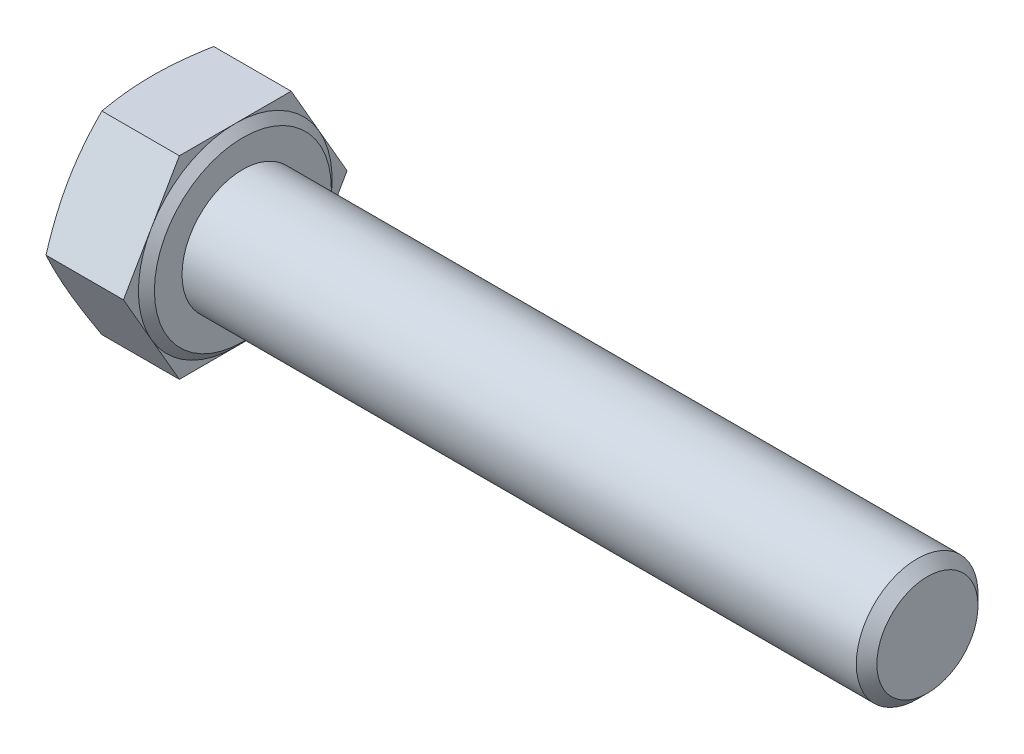
ISO-10303-21;
HEADER;
FILE_DESCRIPTION(('STEP AP214'),'2;1');
FILE_NAME('part.step','',(''),(''),'','','');
FILE_SCHEMA(('AUTOMOTIVE_DESIGN { 1 0 10303 214 1 1 1 1 }'));
ENDSEC;
DATA;
#1=APPLICATION_CONTEXT('core data for automotive mechanical design processes');
#2=APPLICATION_PROTOCOL_DEFINITION('international standard','automotive_design',2000,#1);
#3=PRODUCT_CONTEXT('',#1,'mechanical');
#4=PRODUCT('Part','Part','',(#3));
#5=PRODUCT_RELATED_PRODUCT_CATEGORY('part','',(#4));
#6=PRODUCT_DEFINITION_FORMATION('','',#4);
#7=PRODUCT_DEFINITION_CONTEXT('part definition',#1,'design');
#8=PRODUCT_DEFINITION('design','',#6,#7);
#9=PRODUCT_DEFINITION_SHAPE('','',#8);
#10=(LENGTH_UNIT() NAMED_UNIT(*) SI_UNIT(.MILLI.,.METRE.));
#11=(NAMED_UNIT(*) PLANE_ANGLE_UNIT() SI_UNIT($,.RADIAN.));
#12=(NAMED_UNIT(*) SI_UNIT($,.STERADIAN.) SOLID_ANGLE_UNIT());
#13=UNCERTAINTY_MEASURE_WITH_UNIT(LENGTH_MEASURE(1.E-05),#10,'distance_accuracy_value','');
#14=(GEOMETRIC_REPRESENTATION_CONTEXT(3) GLOBAL_UNCERTAINTY_ASSIGNED_CONTEXT((#13)) GLOBAL_UNIT_ASSIGNED_CONTEXT((#10,
#11,#12)) REPRESENTATION_CONTEXT('',''));
#15=CARTESIAN_POINT('',(0.,0.,0.));
#16=DIRECTION('',(0.,0.,1.));
#17=DIRECTION('',(1.,0.,0.));
#18=AXIS2_PLACEMENT_3D('',#15,#16,#17);
#19=CARTESIAN_POINT('',(5.95,0.,0.));
#20=DIRECTION('',(1.,0.,0.));
#21=DIRECTION('',(0.,0.,-1.));
#22=AXIS2_PLACEMENT_3D('',#19,#20,#21);
#23=PLANE('',#22);
#24=CARTESIAN_POINT('',(5.95,0.,0.));
#25=DIRECTION('',(-1.,0.,0.));
#26=DIRECTION('',(0.,0.,1.));
#27=AXIS2_PLACEMENT_3D('',#24,#25,#26);
#28=CIRCLE('',#27,5.815);
#29=CARTESIAN_POINT('',(5.95,0.,5.815));
#30=VERTEX_POINT('',#29);
#31=EDGE_CURVE('E141',#30,#30,#28,.T.);
#32=ORIENTED_EDGE('',*,*,#31,.F.);
#33=EDGE_LOOP('',(#32));
#34=FACE_BOUND('',#33,.T.);
#35=CARTESIAN_POINT('',(5.95,0.,0.));
#36=DIRECTION('',(1.,0.,0.));
#37=DIRECTION('',(0.,0.,-1.));
#38=AXIS2_PLACEMENT_3D('',#35,#36,#37);
#39=CIRCLE('',#38,4.);
#40=CARTESIAN_POINT('',(5.95,0.,4.));
#41=VERTEX_POINT('',#40);
#42=EDGE_CURVE('E142',#41,#41,#39,.T.);
#43=ORIENTED_EDGE('',*,*,#42,.F.);
#44=EDGE_LOOP('',(#43));
#45=FACE_BOUND('',#44,.T.);
#46=ADVANCED_FACE('F37',(#34,#45),#23,.T.);
#47=CARTESIAN_POINT('',(5.45,0.,-7.34966892678395));
#48=DIRECTION('',(1.,0.,0.));
#49=DIRECTION('',(0.,0.,-1.));
#50=AXIS2_PLACEMENT_3D('',#47,#48,#49);
#51=PLANE('',#50);
#52=DIRECTION('',(0.,-0.866025403784439,0.5));
#53=VECTOR('',#52,1.);
#54=CARTESIAN_POINT('',(5.45,6.365,3.67483446339196));
#55=LINE('',#54,#53);
#56=CARTESIAN_POINT('',(5.45,6.365,3.67483446339196));
#57=VERTEX_POINT('',#56);
#58=CARTESIAN_POINT('',(5.45,3.18249999999999,5.51225169508794));
#59=VERTEX_POINT('',#58);
#60=EDGE_CURVE('E140',#57,#59,#55,.T.);
#61=ORIENTED_EDGE('',*,*,#60,.T.);
#62=CARTESIAN_POINT('',(5.45,0.,0.));
#63=DIRECTION('',(-1.,0.,0.));
#64=DIRECTION('',(0.,0.,1.));
#65=AXIS2_PLACEMENT_3D('',#62,#63,#64);
#66=CIRCLE('',#65,6.365);
#67=CARTESIAN_POINT('',(5.45,6.365,0.));
#68=VERTEX_POINT('',#67);
#69=EDGE_CURVE('E52',#59,#68,#66,.T.);
#70=ORIENTED_EDGE('',*,*,#69,.T.);
#71=DIRECTION('',(0.,0.,1.));
#72=VECTOR('',#71,1.);
#73=CARTESIAN_POINT('',(5.45,6.365,-3.67483446339198));
#74=LINE('',#73,#72);
#75=EDGE_CURVE('E137',#68,#57,#74,.T.);
#76=ORIENTED_EDGE('',*,*,#75,.T.);
#77=EDGE_LOOP('',(#61,#70,#76));
#78=FACE_BOUND('',#77,.T.);
#79=ADVANCED_FACE('F136',(#78),#51,.T.);
#80=CARTESIAN_POINT('',(5.45,6.365,-3.67483446339198));
#81=VERTEX_POINT('',#80);
#82=EDGE_CURVE('E148',#81,#68,#74,.T.);
#83=ORIENTED_EDGE('',*,*,#82,.T.);
#84=CARTESIAN_POINT('',(5.45,3.1825,-5.51225169508795));
#85=VERTEX_POINT('',#84);
#86=EDGE_CURVE('E125',#68,#85,#66,.T.);
#87=ORIENTED_EDGE('',*,*,#86,.T.);
#88=DIRECTION('',(0.,0.866025403784438,0.5));
#89=VECTOR('',#88,1.);
#90=CARTESIAN_POINT('',(5.45,0.,-7.34966892678395));
#91=LINE('',#90,#89);
#92=EDGE_CURVE('E154',#85,#81,#91,.T.);
#93=ORIENTED_EDGE('',*,*,#92,.T.);
#94=EDGE_LOOP('',(#83,#87,#93));
#95=FACE_BOUND('',#94,.T.);
#96=ADVANCED_FACE('F153',(#95),#51,.T.);
#97=CARTESIAN_POINT('',(5.45,0.,-7.34966892678395));
#98=VERTEX_POINT('',#97);
#99=EDGE_CURVE('E151',#98,#85,#91,.T.);
#100=ORIENTED_EDGE('',*,*,#99,.T.);
#101=CARTESIAN_POINT('',(5.45,-3.1825,-5.51225169508795));
#102=VERTEX_POINT('',#101);
#103=EDGE_CURVE('E128',#85,#102,#66,.T.);
#104=ORIENTED_EDGE('',*,*,#103,.T.);
#105=DIRECTION('',(0.,0.866025403784438,-0.5));
#106=VECTOR('',#105,1.);
#107=CARTESIAN_POINT('',(5.45,-6.365,-3.67483446339198));
#108=LINE('',#107,#106);
#109=EDGE_CURVE('E299',#102,#98,#108,.T.);
#110=ORIENTED_EDGE('',*,*,#109,.T.);
#111=EDGE_LOOP('',(#100,#104,#110));
#112=FACE_BOUND('',#111,.T.);
#113=ADVANCED_FACE('F443',(#112),#51,.T.);
#114=CARTESIAN_POINT('',(5.45,-6.365,-3.67483446339198));
#115=VERTEX_POINT('',#114);
#116=EDGE_CURVE('E297',#115,#102,#108,.T.);
#117=ORIENTED_EDGE('',*,*,#116,.T.);
#118=CARTESIAN_POINT('',(5.45,-6.365,0.));
#119=VERTEX_POINT('',#118);
#120=EDGE_CURVE('E367',#102,#119,#66,.T.);
#121=ORIENTED_EDGE('',*,*,#120,.T.);
#122=DIRECTION('',(0.,0.,-1.));
#123=VECTOR('',#122,1.);
#124=CARTESIAN_POINT('',(5.45,-6.365,3.67483446339195));
#125=LINE('',#124,#123);
#126=EDGE_CURVE('E165',#119,#115,#125,.T.);
#127=ORIENTED_EDGE('',*,*,#126,.T.);
#128=EDGE_LOOP('',(#117,#121,#127));
#129=FACE_BOUND('',#128,.T.);
#130=ADVANCED_FACE('F451',(#129),#51,.T.);
#131=CARTESIAN_POINT('',(5.45,-6.365,3.67483446339195));
#132=VERTEX_POINT('',#131);
#133=EDGE_CURVE('E166',#132,#119,#125,.T.);
#134=ORIENTED_EDGE('',*,*,#133,.T.);
#135=CARTESIAN_POINT('',(5.45,-3.1825,5.51225169508795));
#136=VERTEX_POINT('',#135);
#137=EDGE_CURVE('E366',#119,#136,#66,.T.);
#138=ORIENTED_EDGE('',*,*,#137,.T.);
#139=DIRECTION('',(0.,-0.866025403784438,-0.5));
#140=VECTOR('',#139,1.);
#141=CARTESIAN_POINT('',(5.45,0.,7.34966892678392));
#142=LINE('',#141,#140);
#143=EDGE_CURVE('E161',#136,#132,#142,.T.);
#144=ORIENTED_EDGE('',*,*,#143,.T.);
#145=EDGE_LOOP('',(#134,#138,#144));
#146=FACE_BOUND('',#145,.T.);
#147=ADVANCED_FACE('F281',(#146),#51,.T.);
#148=CARTESIAN_POINT('',(5.45,0.,7.34966892678392));
#149=VERTEX_POINT('',#148);
#150=EDGE_CURVE('E162',#149,#136,#142,.T.);
#151=ORIENTED_EDGE('',*,*,#150,.T.);
#152=EDGE_CURVE('E143',#136,#59,#66,.T.);
#153=ORIENTED_EDGE('',*,*,#152,.T.);
#154=EDGE_CURVE('E156',#59,#149,#55,.T.);
#155=ORIENTED_EDGE('',*,*,#154,.T.);
#156=EDGE_LOOP('',(#151,#153,#155));
#157=FACE_BOUND('',#156,.T.);
#158=ADVANCED_FACE('F208',(#157),#51,.T.);
#159=CARTESIAN_POINT('',(5.45,-6.365,-3.67483446339198));
#160=DIRECTION('',(0.,0.5,0.866025403784438));
#161=DIRECTION('',(0.,-0.866025403784439,0.5));
#162=AXIS2_PLACEMENT_3D('',#159,#160,#161);
#163=PLANE('',#162);
#164=CARTESIAN_POINT('',(0.358432208609166,0.000200000000001466,-7.34978439683779));
#165=CARTESIAN_POINT('',(0.303017853386465,-0.263405120230137,-7.19759190971315));
#166=CARTESIAN_POINT('',(0.252608898537306,-0.52787949910755,-7.04489755587452));
#167=CARTESIAN_POINT('',(0.163922131489337,-1.05854790500846,-6.73851600887719));
#168=CARTESIAN_POINT('',(0.125653812123524,-1.3247431124377,-6.58482813421094));
#169=CARTESIAN_POINT('',(0.0637558982239302,-1.85589900422329,-6.27816513710687));
#170=CARTESIAN_POINT('',(0.0399912941880073,-2.12084755808325,-6.12519701821442));
#171=CARTESIAN_POINT('',(0.00811628005094213,-2.65136425446848,-5.81890306074682));
#172=CARTESIAN_POINT('',(0.,-2.91693212723424,-5.66557737791739));
#173=CARTESIAN_POINT('',(0.,-3.44806787276576,-5.35892601225854));
#174=CARTESIAN_POINT('',(0.00811628005094204,-3.71363574553151,-5.20560032942911));
#175=CARTESIAN_POINT('',(0.0399912941880067,-4.24415244191675,-4.8993063719615));
#176=CARTESIAN_POINT('',(0.0637558982239292,-4.50910099577671,-4.74633825306905));
#177=CARTESIAN_POINT('',(0.125653812123522,-5.0402568875623,-4.43967525596499));
#178=CARTESIAN_POINT('',(0.163922131489336,-5.30645209499153,-4.28598738129873));
#179=CARTESIAN_POINT('',(0.252608898537303,-5.83712050089245,-3.97960583430141));
#180=CARTESIAN_POINT('',(0.303017853386463,-6.10159487976986,-3.82691148046277));
#181=CARTESIAN_POINT('',(0.358432208609164,-6.3652,-3.67471899333814));
#182=B_SPLINE_CURVE_WITH_KNOTS('',3,(#164,#165,#166,#167,#168,#169,#170,#171,#172,#173,#174,
#175,#176,#177,#178,#179,#180,#181),.UNSPECIFIED.,.F.,.F.,(4,2,2,2,2,2,2,2,4),(0.,
0.928259882660236,1.85724379836754,2.77744274027351,3.69729643285266,4.6171501254318,
5.53734906733777,6.46633298304508,7.39459286570531),.UNSPECIFIED.);
#183=CARTESIAN_POINT('',(0.358390179956195,0.,-7.34966892678395));
#184=VERTEX_POINT('',#183);
#185=CARTESIAN_POINT('',(0.,-3.1825,-5.51225169508795));
#186=VERTEX_POINT('',#185);
#187=EDGE_CURVE('E287',#184,#186,#182,.T.);
#188=ORIENTED_EDGE('',*,*,#187,.F.);
#189=DIRECTION('',(-1.,0.,0.));
#190=VECTOR('',#189,1.);
#191=CARTESIAN_POINT('',(5.45,0.,-7.34966892678395));
#192=LINE('',#191,#190);
#193=EDGE_CURVE('E181',#98,#184,#192,.T.);
#194=ORIENTED_EDGE('',*,*,#193,.F.);
#195=ORIENTED_EDGE('',*,*,#109,.F.);
#196=ORIENTED_EDGE('',*,*,#116,.F.);
#197=DIRECTION('',(-1.,0.,0.));
#198=VECTOR('',#197,1.);
#199=CARTESIAN_POINT('',(5.45,-6.365,-3.67483446339198));
#200=LINE('',#199,#198);
#201=CARTESIAN_POINT('',(0.358390179956195,-6.365,-3.67483446339199));
#202=VERTEX_POINT('',#201);
#203=EDGE_CURVE('E169',#115,#202,#200,.T.);
#204=ORIENTED_EDGE('',*,*,#203,.T.);
#205=EDGE_CURVE('E243',#186,#202,#182,.T.);
#206=ORIENTED_EDGE('',*,*,#205,.F.);
#207=EDGE_LOOP('',(#188,#194,#195,#196,#204,#206));
#208=FACE_BOUND('',#207,.T.);
#209=ADVANCED_FACE('F272',(#208),#163,.F.);
#210=CARTESIAN_POINT('',(5.45,0.,-7.34966892678395));
#211=DIRECTION('',(0.,-0.5,0.866025403784438));
#212=DIRECTION('',(0.,-0.866025403784438,-0.5));
#213=AXIS2_PLACEMENT_3D('',#210,#211,#212);
#214=PLANE('',#213);
#215=CARTESIAN_POINT('',(0.358432208609163,6.3652,-3.67471899333814));
#216=CARTESIAN_POINT('',(0.303017853386462,6.10159487976986,-3.82691148046277));
#217=CARTESIAN_POINT('',(0.252608898537303,5.83712050089245,-3.97960583430141));
#218=CARTESIAN_POINT('',(0.163922131489336,5.30645209499153,-4.28598738129873));
#219=CARTESIAN_POINT('',(0.125653812123522,5.0402568875623,-4.43967525596499));
#220=CARTESIAN_POINT('',(0.0637558982239288,4.50910099577671,-4.74633825306905));
#221=CARTESIAN_POINT('',(0.0399912941880062,4.24415244191675,-4.8993063719615));
#222=CARTESIAN_POINT('',(0.00811628005094158,3.71363574553151,-5.20560032942911));
#223=CARTESIAN_POINT('',(0.,3.44806787276576,-5.35892601225853));
#224=CARTESIAN_POINT('',(0.,2.91693212723424,-5.66557737791739));
#225=CARTESIAN_POINT('',(0.00811628005094232,2.65136425446849,-5.81890306074681));
#226=CARTESIAN_POINT('',(0.0399912941880074,2.12084755808325,-6.12519701821442));
#227=CARTESIAN_POINT('',(0.0637558982239301,1.85589900422329,-6.27816513710687));
#228=CARTESIAN_POINT('',(0.125653812123523,1.3247431124377,-6.58482813421094));
#229=CARTESIAN_POINT('',(0.163922131489337,1.05854790500846,-6.73851600887719));
#230=CARTESIAN_POINT('',(0.252608898537306,0.527879499107553,-7.04489755587452));
#231=CARTESIAN_POINT('',(0.303017853386465,0.263405120230139,-7.19759190971315));
#232=CARTESIAN_POINT('',(0.358432208609166,-0.000199999999999462,-7.34978439683778));
#233=B_SPLINE_CURVE_WITH_KNOTS('',3,(#215,#216,#217,#218,#219,#220,#221,#222,#223,#224,#225,
#226,#227,#228,#229,#230,#231,#232),.UNSPECIFIED.,.F.,.F.,(4,2,2,2,2,2,2,2,4),(0.,
0.928259882660236,1.85724379836754,2.77744274027351,3.69729643285265,4.6171501254318,
5.53734906733777,6.46633298304507,7.39459286570531),.UNSPECIFIED.);
#234=CARTESIAN_POINT('',(0.358390179956195,6.365,-3.67483446339199));
#235=VERTEX_POINT('',#234);
#236=CARTESIAN_POINT('',(0.,3.1825,-5.51225169508795));
#237=VERTEX_POINT('',#236);
#238=EDGE_CURVE('E262',#235,#237,#233,.T.);
#239=ORIENTED_EDGE('',*,*,#238,.F.);
#240=DIRECTION('',(-1.,0.,0.));
#241=VECTOR('',#240,1.);
#242=CARTESIAN_POINT('',(5.45,6.365,-3.67483446339198));
#243=LINE('',#242,#241);
#244=EDGE_CURVE('E179',#81,#235,#243,.T.);
#245=ORIENTED_EDGE('',*,*,#244,.F.);
#246=ORIENTED_EDGE('',*,*,#92,.F.);
#247=ORIENTED_EDGE('',*,*,#99,.F.);
#248=ORIENTED_EDGE('',*,*,#193,.T.);
#249=EDGE_CURVE('E256',#237,#184,#233,.T.);
#250=ORIENTED_EDGE('',*,*,#249,.F.);
#251=EDGE_LOOP('',(#239,#245,#246,#247,#248,#250));
#252=FACE_BOUND('',#251,.T.);
#253=ADVANCED_FACE('F269',(#252),#214,.F.);
#254=CARTESIAN_POINT('',(5.45,6.365,-3.67483446339198));
#255=DIRECTION('',(0.,-1.,0.));
#256=DIRECTION('',(0.,0.,-1.));
#257=AXIS2_PLACEMENT_3D('',#254,#255,#256);
#258=PLANE('',#257);
#259=CARTESIAN_POINT('',(1.91509499186738,6.365,-9.7296694984424));
#260=CARTESIAN_POINT('',(1.8274065254308,6.365,-9.44169388100943));
#261=CARTESIAN_POINT('',(1.74074126923369,6.365,-9.15340090389345));
#262=CARTESIAN_POINT('',(1.57002321571733,6.365,-8.57601866069179));
#263=CARTESIAN_POINT('',(1.48597062512317,6.365,-8.28692933355569));
#264=CARTESIAN_POINT('',(1.32090412051867,6.365,-7.70729801333674));
#265=CARTESIAN_POINT('',(1.23989616851068,6.365,-7.41675431626873));
#266=CARTESIAN_POINT('',(1.08186732342096,6.365,-6.83458613240287));
#267=CARTESIAN_POINT('',(1.00484635875195,6.365,-6.54296166511132));
#268=CARTESIAN_POINT('',(0.856697872735636,6.365,-5.96204124254702));
#269=CARTESIAN_POINT('',(0.785509396690932,6.365,-5.67276090957682));
#270=CARTESIAN_POINT('',(0.64919328993161,6.365,-5.09276074741789));
#271=CARTESIAN_POINT('',(0.584065761213718,6.365,-4.80204089409086));
#272=CARTESIAN_POINT('',(0.461389936625072,6.365,-4.21909663970475));
#273=CARTESIAN_POINT('',(0.403839055373967,6.365,-3.92687278740828));
#274=CARTESIAN_POINT('',(0.2980689318816,6.365,-3.3407285208215));
#275=CARTESIAN_POINT('',(0.249849376986923,6.365,-3.04680816371385));
#276=CARTESIAN_POINT('',(0.169475259692935,6.365,-2.4903674737322));
#277=CARTESIAN_POINT('',(0.136125658249983,6.365,-2.2280213791775));
#278=CARTESIAN_POINT('',(0.0796727278870323,6.365,-1.70221986064311));
#279=CARTESIAN_POINT('',(0.0565691003887711,6.365,-1.43876446921536));
#280=CARTESIAN_POINT('',(0.0217207413568141,6.365,-0.911278741623913));
#281=CARTESIAN_POINT('',(0.00996797550584855,6.365,-0.64724894489987));
#282=CARTESIAN_POINT('',(-0.00158362003896366,6.365,-0.118925195375255));
#283=CARTESIAN_POINT('',(-0.00138253415055085,6.365,0.145368755546687));
#284=CARTESIAN_POINT('',(0.0109939536907339,6.365,0.675012581557852));
#285=CARTESIAN_POINT('',(0.0232300782774895,6.365,0.940361014088002));
#286=CARTESIAN_POINT('',(0.0591135341292779,6.365,1.47027848456429));
#287=CARTESIAN_POINT('',(0.0827611395476106,6.365,1.73484750363189));
#288=CARTESIAN_POINT('',(0.140361333008317,6.365,2.26307550737216));
#289=CARTESIAN_POINT('',(0.1743227721838,6.365,2.526733512897));
#290=CARTESIAN_POINT('',(0.251173066655275,6.365,3.0527305061695));
#291=CARTESIAN_POINT('',(0.294061969799614,6.365,3.31506948683989));
#292=CARTESIAN_POINT('',(0.38983936183337,6.365,3.85223342679726));
#293=CARTESIAN_POINT('',(0.443136786671213,6.365,4.12698482215219));
#294=CARTESIAN_POINT('',(0.556591356183898,6.365,4.67507669275939));
#295=CARTESIAN_POINT('',(0.616749018019993,6.365,4.94841706001511));
#296=CARTESIAN_POINT('',(0.742660775422184,6.365,5.49388169043513));
#297=CARTESIAN_POINT('',(0.808416496316156,6.365,5.76600557610647));
#298=CARTESIAN_POINT('',(0.944455081390743,6.365,6.3091069066798));
#299=CARTESIAN_POINT('',(1.01473783705961,6.365,6.58008437889518));
#300=CARTESIAN_POINT('',(1.1590752234491,6.365,7.12140066025615));
#301=CARTESIAN_POINT('',(1.23313456342593,6.365,7.39173820927582));
#302=CARTESIAN_POINT('',(1.38427072653871,6.365,7.93157008073457));
#303=CARTESIAN_POINT('',(1.46134759410965,6.365,8.20106439069327));
#304=CARTESIAN_POINT('',(1.6962389843436,6.365,9.00837554769516));
#305=CARTESIAN_POINT('',(1.85774092685403,6.365,9.54511881028881));
#306=CARTESIAN_POINT('',(2.18566542053362,6.365,10.6106008162262));
#307=CARTESIAN_POINT('',(2.35201398242583,6.365,11.1393625186539));
#308=CARTESIAN_POINT('',(2.68943708333289,6.365,12.1954006558518));
#309=CARTESIAN_POINT('',(2.86051184909409,6.365,12.7226770180188));
#310=CARTESIAN_POINT('',(3.20545958847819,6.365,13.7740953538946));
#311=CARTESIAN_POINT('',(3.37931948179169,6.365,14.2982416293346));
#312=CARTESIAN_POINT('',(3.64203874267391,6.365,15.0837909084871));
#313=CARTESIAN_POINT('',(3.72992982044976,6.365,15.3455184496298));
#314=CARTESIAN_POINT('',(3.9062806915208,6.365,15.8687811832806));
#315=CARTESIAN_POINT('',(3.99474048342973,6.365,16.1303163762558));
#316=CARTESIAN_POINT('',(4.08344651066457,6.365,16.3917680143764));
#317=B_SPLINE_CURVE_WITH_KNOTS('',3,(#259,#260,#261,#262,#263,#264,#265,#266,#267,#268,#269,
#270,#271,#272,#273,#274,#275,#276,#277,#278,#279,#280,#281,#282,#283,#284,#285,#286,#287,#288,
#289,#290,#291,#292,#293,#294,#295,#296,#297,#298,#299,#300,#301,#302,#303,#304,#305,#306,#307,
#308,#309,#310,#311,#312,#313,#314,#315,#316),.UNSPECIFIED.,.F.,.F.,(4,2,2,2,2,2,2,2,2,2,2,2,2,
2,2,2,2,2,2,2,2,2,2,2,2,2,2,2,4),(0.,0.903097207575023,1.80626569103696,2.71111926177277,
3.61595658001542,4.50963771767758,5.40333389194527,6.29672431533665,7.19008479979588,
7.98328255418382,8.77645719245087,9.56906999696307,10.3616772040682,11.1583041227231,
11.9549501807672,12.7522818463206,13.5496177854262,14.3891296715289,15.2287048864037,
16.0685246984409,16.9083243877203,17.7491981806695,18.5900843606705,20.2715515655816,
21.9344590099833,23.5974463737565,25.2541238016063,26.0823957883024,26.9106657568178),.UNSPECIFIED.);
#318=CARTESIAN_POINT('',(0.358390179956196,6.36500000000003,3.67483446339194));
#319=VERTEX_POINT('',#318);
#320=CARTESIAN_POINT('',(0.,6.365,0.));
#321=VERTEX_POINT('',#320);
#322=EDGE_CURVE('E60',#319,#321,#317,.F.);
#323=ORIENTED_EDGE('',*,*,#322,.F.);
#324=DIRECTION('',(-1.,0.,0.));
#325=VECTOR('',#324,1.);
#326=CARTESIAN_POINT('',(5.45,6.365,3.67483446339196));
#327=LINE('',#326,#325);
#328=EDGE_CURVE('E150',#57,#319,#327,.T.);
#329=ORIENTED_EDGE('',*,*,#328,.F.);
#330=ORIENTED_EDGE('',*,*,#75,.F.);
#331=ORIENTED_EDGE('',*,*,#82,.F.);
#332=ORIENTED_EDGE('',*,*,#244,.T.);
#333=EDGE_CURVE('E263',#321,#235,#317,.F.);
#334=ORIENTED_EDGE('',*,*,#333,.F.);
#335=EDGE_LOOP('',(#323,#329,#330,#331,#332,#334));
#336=FACE_BOUND('',#335,.T.);
#337=ADVANCED_FACE('F146',(#336),#258,.F.);
#338=CARTESIAN_POINT('',(5.45,6.365,3.67483446339196));
#339=DIRECTION('',(0.,-0.5,-0.866025403784439));
#340=DIRECTION('',(0.,0.866025403784439,-0.5));
#341=AXIS2_PLACEMENT_3D('',#338,#339,#340);
#342=PLANE('',#341);
#343=CARTESIAN_POINT('',(0.358432208609158,-0.000200000000000945,7.34978439683776));
#344=CARTESIAN_POINT('',(0.303017853386457,0.263405120230138,7.19759190971313));
#345=CARTESIAN_POINT('',(0.252608898537298,0.527879499107551,7.04489755587449));
#346=CARTESIAN_POINT('',(0.16392213148933,1.05854790500846,6.73851600887717));
#347=CARTESIAN_POINT('',(0.125653812123516,1.3247431124377,6.58482813421092));
#348=CARTESIAN_POINT('',(0.0637558982239226,1.85589900422329,6.27816513710685));
#349=CARTESIAN_POINT('',(0.039991294188,2.12084755808325,6.1251970182144));
#350=CARTESIAN_POINT('',(0.008116280050935,2.65136425446849,5.81890306074679));
#351=CARTESIAN_POINT('',(0.,2.91693212723424,5.66557737791737));
#352=CARTESIAN_POINT('',(0.,3.44806787276576,5.35892601225851));
#353=CARTESIAN_POINT('',(0.00811628005093566,3.71363574553151,5.20560032942909));
#354=CARTESIAN_POINT('',(0.039991294188001,4.24415244191675,4.89930637196148));
#355=CARTESIAN_POINT('',(0.0637558982239236,4.50910099577671,4.74633825306903));
#356=CARTESIAN_POINT('',(0.125653812123517,5.0402568875623,4.43967525596496));
#357=CARTESIAN_POINT('',(0.163922131489331,5.30645209499154,4.28598738129871));
#358=CARTESIAN_POINT('',(0.2526088985373,5.83712050089245,3.97960583430138));
#359=CARTESIAN_POINT('',(0.303017853386459,6.10159487976986,3.82691148046275));
#360=CARTESIAN_POINT('',(0.35843220860916,6.3652,3.67471899333812));
#361=B_SPLINE_CURVE_WITH_KNOTS('',3,(#343,#344,#345,#346,#347,#348,#349,#350,#351,#352,#353,
#354,#355,#356,#357,#358,#359,#360),.UNSPECIFIED.,.F.,.F.,(4,2,2,2,2,2,2,2,4),(0.,
0.928259882660236,1.85724379836754,2.77744274027351,3.69729643285266,4.6171501254318,
5.53734906733777,6.46633298304508,7.39459286570531),.UNSPECIFIED.);
#362=CARTESIAN_POINT('',(0.358390179956197,0.,7.34966892678395));
#363=VERTEX_POINT('',#362);
#364=CARTESIAN_POINT('',(0.,3.1825,5.51225169508795));
#365=VERTEX_POINT('',#364);
#366=EDGE_CURVE('E249',#363,#365,#361,.T.);
#367=ORIENTED_EDGE('',*,*,#366,.F.);
#368=DIRECTION('',(-1.,0.,0.));
#369=VECTOR('',#368,1.);
#370=CARTESIAN_POINT('',(5.45,0.,7.34966892678392));
#371=LINE('',#370,#369);
#372=EDGE_CURVE('E175',#149,#363,#371,.T.);
#373=ORIENTED_EDGE('',*,*,#372,.F.);
#374=ORIENTED_EDGE('',*,*,#154,.F.);
#375=ORIENTED_EDGE('',*,*,#60,.F.);
#376=ORIENTED_EDGE('',*,*,#328,.T.);
#377=EDGE_CURVE('E303',#365,#319,#361,.T.);
#378=ORIENTED_EDGE('',*,*,#377,.F.);
#379=EDGE_LOOP('',(#367,#373,#374,#375,#376,#378));
#380=FACE_BOUND('',#379,.T.);
#381=ADVANCED_FACE('F352',(#380),#342,.F.);
#382=CARTESIAN_POINT('',(5.45,0.,7.34966892678392));
#383=DIRECTION('',(0.,0.5,-0.866025403784438));
#384=DIRECTION('',(0.,0.866025403784438,0.5));
#385=AXIS2_PLACEMENT_3D('',#382,#383,#384);
#386=PLANE('',#385);
#387=CARTESIAN_POINT('',(0.358432208609159,-6.3652,3.67471899333812));
#388=CARTESIAN_POINT('',(0.303017853386458,-6.10159487976986,3.82691148046275));
#389=CARTESIAN_POINT('',(0.252608898537299,-5.83712050089245,3.97960583430138));
#390=CARTESIAN_POINT('',(0.163922131489331,-5.30645209499153,4.28598738129871));
#391=CARTESIAN_POINT('',(0.125653812123517,-5.0402568875623,4.43967525596496));
#392=CARTESIAN_POINT('',(0.0637558982239232,-4.50910099577671,4.74633825306903));
#393=CARTESIAN_POINT('',(0.0399912941880006,-4.24415244191675,4.89930637196148));
#394=CARTESIAN_POINT('',(0.00811628005093541,-3.71363574553151,5.20560032942909));
#395=CARTESIAN_POINT('',(0.,-3.44806787276576,5.35892601225851));
#396=CARTESIAN_POINT('',(0.,-2.91693212723424,5.66557737791736));
#397=CARTESIAN_POINT('',(0.00811628005093514,-2.65136425446849,5.81890306074679));
#398=CARTESIAN_POINT('',(0.039991294188,-2.12084755808325,6.1251970182144));
#399=CARTESIAN_POINT('',(0.0637558982239224,-1.85589900422329,6.27816513710685));
#400=CARTESIAN_POINT('',(0.125653812123515,-1.3247431124377,6.58482813421091));
#401=CARTESIAN_POINT('',(0.163922131489329,-1.05854790500847,6.73851600887717));
#402=CARTESIAN_POINT('',(0.252608898537298,-0.527879499107553,7.04489755587449));
#403=CARTESIAN_POINT('',(0.303017853386457,-0.263405120230141,7.19759190971313));
#404=CARTESIAN_POINT('',(0.358432208609158,0.000199999999998151,7.34978439683776));
#405=B_SPLINE_CURVE_WITH_KNOTS('',3,(#387,#388,#389,#390,#391,#392,#393,#394,#395,#396,#397,
#398,#399,#400,#401,#402,#403,#404),.UNSPECIFIED.,.F.,.F.,(4,2,2,2,2,2,2,2,4),(0.,
0.928259882660235,1.85724379836754,2.77744274027351,3.69729643285265,4.6171501254318,
5.53734906733777,6.46633298304507,7.39459286570531),.UNSPECIFIED.);
#406=CARTESIAN_POINT('',(0.358390179956196,-6.365,3.67483446339199));
#407=VERTEX_POINT('',#406);
#408=CARTESIAN_POINT('',(0.,-3.1825,5.51225169508795));
#409=VERTEX_POINT('',#408);
#410=EDGE_CURVE('E235',#407,#409,#405,.T.);
#411=ORIENTED_EDGE('',*,*,#410,.F.);
#412=DIRECTION('',(-1.,0.,0.));
#413=VECTOR('',#412,1.);
#414=CARTESIAN_POINT('',(5.45,-6.365,3.67483446339195));
#415=LINE('',#414,#413);
#416=EDGE_CURVE('E172',#132,#407,#415,.T.);
#417=ORIENTED_EDGE('',*,*,#416,.F.);
#418=ORIENTED_EDGE('',*,*,#143,.F.);
#419=ORIENTED_EDGE('',*,*,#150,.F.);
#420=ORIENTED_EDGE('',*,*,#372,.T.);
#421=EDGE_CURVE('E291',#409,#363,#405,.T.);
#422=ORIENTED_EDGE('',*,*,#421,.F.);
#423=EDGE_LOOP('',(#411,#417,#418,#419,#420,#422));
#424=FACE_BOUND('',#423,.T.);
#425=ADVANCED_FACE('F348',(#424),#386,.F.);
#426=CARTESIAN_POINT('',(5.45,-6.365,3.67483446339195));
#427=DIRECTION('',(0.,1.,0.));
#428=DIRECTION('',(0.,0.,1.));
#429=AXIS2_PLACEMENT_3D('',#426,#427,#428);
#430=PLANE('',#429);
#431=CARTESIAN_POINT('',(1.91509499186738,-6.365,-9.7296694984424));
#432=CARTESIAN_POINT('',(1.8274065254308,-6.365,-9.44169388100943));
#433=CARTESIAN_POINT('',(1.74074126923369,-6.365,-9.15340090389345));
#434=CARTESIAN_POINT('',(1.57002321571733,-6.365,-8.57601866069178));
#435=CARTESIAN_POINT('',(1.48597062512317,-6.365,-8.28692933355569));
#436=CARTESIAN_POINT('',(1.32090412051867,-6.365,-7.70729801333674));
#437=CARTESIAN_POINT('',(1.23989616851068,-6.365,-7.41675431626872));
#438=CARTESIAN_POINT('',(1.08186732342096,-6.365,-6.83458613240287));
#439=CARTESIAN_POINT('',(1.00484635875195,-6.365,-6.54296166511132));
#440=CARTESIAN_POINT('',(0.856697872735636,-6.365,-5.96204124254702));
#441=CARTESIAN_POINT('',(0.785509396690932,-6.365,-5.67276090957682));
#442=CARTESIAN_POINT('',(0.649193289931609,-6.365,-5.09276074741789));
#443=CARTESIAN_POINT('',(0.584065761213718,-6.365,-4.80204089409086));
#444=CARTESIAN_POINT('',(0.461389936625072,-6.365,-4.21909663970475));
#445=CARTESIAN_POINT('',(0.403839055373967,-6.365,-3.92687278740828));
#446=CARTESIAN_POINT('',(0.2980689318816,-6.365,-3.3407285208215));
#447=CARTESIAN_POINT('',(0.249849376986923,-6.365,-3.04680816371385));
#448=CARTESIAN_POINT('',(0.169475259692935,-6.365,-2.4903674737322));
#449=CARTESIAN_POINT('',(0.136125658249983,-6.365,-2.2280213791775));
#450=CARTESIAN_POINT('',(0.0796727278870323,-6.365,-1.70221986064312));
#451=CARTESIAN_POINT('',(0.0565691003887709,-6.365,-1.43876446921537));
#452=CARTESIAN_POINT('',(0.0217207413568139,-6.365,-0.911278741623917));
#453=CARTESIAN_POINT('',(0.00996797550584833,-6.365,-0.647248944899874));
#454=CARTESIAN_POINT('',(-0.00158362003896379,-6.365,-0.118925195375259));
#455=CARTESIAN_POINT('',(-0.00138253415055093,-6.365,0.145368755546683));
#456=CARTESIAN_POINT('',(0.0109939536907337,-6.365,0.675012581557848));
#457=CARTESIAN_POINT('',(0.0232300782774892,-6.365,0.940361014087999));
#458=CARTESIAN_POINT('',(0.0591135341292773,-6.365,1.47027848456429));
#459=CARTESIAN_POINT('',(0.0827611395476098,-6.365,1.73484750363189));
#460=CARTESIAN_POINT('',(0.140361333008316,-6.365,2.26307550737215));
#461=CARTESIAN_POINT('',(0.174322772183799,-6.365,2.526733512897));
#462=CARTESIAN_POINT('',(0.251173066655275,-6.365,3.0527305061695));
#463=CARTESIAN_POINT('',(0.294061969799613,-6.365,3.31506948683988));
#464=CARTESIAN_POINT('',(0.389839361833369,-6.365,3.85223342679726));
#465=CARTESIAN_POINT('',(0.443136786671213,-6.365,4.12698482215219));
#466=CARTESIAN_POINT('',(0.556591356183898,-6.365,4.67507669275939));
#467=CARTESIAN_POINT('',(0.616749018019993,-6.365,4.9484170600151));
#468=CARTESIAN_POINT('',(0.742660775422184,-6.365,5.49388169043513));
#469=CARTESIAN_POINT('',(0.808416496316156,-6.365,5.76600557610647));
#470=CARTESIAN_POINT('',(0.944455081390743,-6.365,6.3091069066798));
#471=CARTESIAN_POINT('',(1.01473783705961,-6.365,6.58008437889518));
#472=CARTESIAN_POINT('',(1.1590752234491,-6.365,7.12140066025615));
#473=CARTESIAN_POINT('',(1.23313456342593,-6.365,7.39173820927582));
#474=CARTESIAN_POINT('',(1.38427072653871,-6.365,7.93157008073457));
#475=CARTESIAN_POINT('',(1.46134759410965,-6.365,8.20106439069328));
#476=CARTESIAN_POINT('',(1.6962389843436,-6.365,9.00837554769517));
#477=CARTESIAN_POINT('',(1.85774092685404,-6.365,9.54511881028882));
#478=CARTESIAN_POINT('',(2.18566542053362,-6.365,10.6106008162262));
#479=CARTESIAN_POINT('',(2.35201398242584,-6.365,11.1393625186539));
#480=CARTESIAN_POINT('',(2.6894370833329,-6.365,12.1954006558518));
#481=CARTESIAN_POINT('',(2.86051184909409,-6.365,12.7226770180188));
#482=CARTESIAN_POINT('',(3.2054595884782,-6.365,13.7740953538946));
#483=CARTESIAN_POINT('',(3.37931948179169,-6.365,14.2982416293346));
#484=CARTESIAN_POINT('',(3.64203874267391,-6.365,15.0837909084871));
#485=CARTESIAN_POINT('',(3.72992982044976,-6.365,15.3455184496298));
#486=CARTESIAN_POINT('',(3.9062806915208,-6.365,15.8687811832806));
#487=CARTESIAN_POINT('',(3.99474048342973,-6.365,16.1303163762558));
#488=CARTESIAN_POINT('',(4.08344651066457,-6.365,16.3917680143764));
#489=B_SPLINE_CURVE_WITH_KNOTS('',3,(#431,#432,#433,#434,#435,#436,#437,#438,#439,#440,#441,
#442,#443,#444,#445,#446,#447,#448,#449,#450,#451,#452,#453,#454,#455,#456,#457,#458,#459,#460,
#461,#462,#463,#464,#465,#466,#467,#468,#469,#470,#471,#472,#473,#474,#475,#476,#477,#478,#479,
#480,#481,#482,#483,#484,#485,#486,#487,#488),.UNSPECIFIED.,.F.,.F.,(4,2,2,2,2,2,2,2,2,2,2,2,2,
2,2,2,2,2,2,2,2,2,2,2,2,2,2,2,4),(0.,0.903097207575025,1.80626569103696,2.71111926177277,
3.61595658001542,4.50963771767758,5.40333389194527,6.29672431533665,7.19008479979587,
7.98328255418381,8.77645719245087,9.56906999696307,10.3616772040682,11.1583041227231,
11.9549501807672,12.7522818463206,13.5496177854262,14.3891296715289,15.2287048864037,
16.0685246984409,16.9083243877203,17.7491981806695,18.5900843606705,20.2715515655816,
21.9344590099833,23.5974463737565,25.2541238016063,26.0823957883024,26.9106657568178),.UNSPECIFIED.);
#490=CARTESIAN_POINT('',(0.,-6.365,0.));
#491=VERTEX_POINT('',#490);
#492=EDGE_CURVE('E311',#202,#491,#489,.T.);
#493=ORIENTED_EDGE('',*,*,#492,.F.);
#494=ORIENTED_EDGE('',*,*,#203,.F.);
#495=ORIENTED_EDGE('',*,*,#126,.F.);
#496=ORIENTED_EDGE('',*,*,#133,.F.);
#497=ORIENTED_EDGE('',*,*,#416,.T.);
#498=EDGE_CURVE('E224',#491,#407,#489,.T.);
#499=ORIENTED_EDGE('',*,*,#498,.F.);
#500=EDGE_LOOP('',(#493,#494,#495,#496,#497,#499));
#501=FACE_BOUND('',#500,.T.);
#502=ADVANCED_FACE('F345',(#501),#430,.F.);
#503=CARTESIAN_POINT('',(0.,0.,0.));
#504=DIRECTION('',(1.,0.,0.));
#505=DIRECTION('',(0.,0.,-1.));
#506=AXIS2_PLACEMENT_3D('',#503,#504,#505);
#507=CONICAL_SURFACE('',#506,6.365,1.22173047639604);
#508=ORIENTED_EDGE('',*,*,#249,.T.);
#509=ORIENTED_EDGE('',*,*,#187,.T.);
#510=CARTESIAN_POINT('',(0.,0.,0.));
#511=DIRECTION('',(1.,0.,0.));
#512=DIRECTION('',(0.,0.,-1.));
#513=AXIS2_PLACEMENT_3D('',#510,#511,#512);
#514=CIRCLE('',#513,6.365);
#515=EDGE_CURVE('E184',#186,#237,#514,.T.);
#516=ORIENTED_EDGE('',*,*,#515,.T.);
#517=EDGE_LOOP('',(#508,#509,#516));
#518=FACE_BOUND('',#517,.T.);
#519=ADVANCED_FACE('F344',(#518),#507,.T.);
#520=ORIENTED_EDGE('',*,*,#205,.T.);
#521=ORIENTED_EDGE('',*,*,#492,.T.);
#522=EDGE_CURVE('E186',#491,#186,#514,.T.);
#523=ORIENTED_EDGE('',*,*,#522,.T.);
#524=EDGE_LOOP('',(#520,#521,#523));
#525=FACE_BOUND('',#524,.T.);
#526=ADVANCED_FACE('F371',(#525),#507,.T.);
#527=ORIENTED_EDGE('',*,*,#410,.T.);
#528=EDGE_CURVE('E369',#409,#491,#514,.T.);
#529=ORIENTED_EDGE('',*,*,#528,.T.);
#530=ORIENTED_EDGE('',*,*,#498,.T.);
#531=EDGE_LOOP('',(#527,#529,#530));
#532=FACE_BOUND('',#531,.T.);
#533=ADVANCED_FACE('F219',(#532),#507,.T.);
#534=ORIENTED_EDGE('',*,*,#366,.T.);
#535=EDGE_CURVE('E368',#365,#409,#514,.T.);
#536=ORIENTED_EDGE('',*,*,#535,.T.);
#537=ORIENTED_EDGE('',*,*,#421,.T.);
#538=EDGE_LOOP('',(#534,#536,#537));
#539=FACE_BOUND('',#538,.T.);
#540=ADVANCED_FACE('F218',(#539),#507,.T.);
#541=ORIENTED_EDGE('',*,*,#322,.T.);
#542=CARTESIAN_POINT('',(0.,0.,0.));
#543=DIRECTION('',(-1.,0.,0.));
#544=DIRECTION('',(0.,0.,1.));
#545=AXIS2_PLACEMENT_3D('',#542,#543,#544);
#546=CIRCLE('',#545,6.365);
#547=EDGE_CURVE('E319',#365,#321,#546,.T.);
#548=ORIENTED_EDGE('',*,*,#547,.F.);
#549=ORIENTED_EDGE('',*,*,#377,.T.);
#550=EDGE_LOOP('',(#541,#548,#549));
#551=FACE_BOUND('',#550,.T.);
#552=ADVANCED_FACE('F214',(#551),#507,.T.);
#553=ORIENTED_EDGE('',*,*,#333,.T.);
#554=ORIENTED_EDGE('',*,*,#238,.T.);
#555=EDGE_CURVE('E187',#237,#321,#514,.T.);
#556=ORIENTED_EDGE('',*,*,#555,.T.);
#557=EDGE_LOOP('',(#553,#554,#556));
#558=FACE_BOUND('',#557,.T.);
#559=ADVANCED_FACE('F217',(#558),#507,.T.);
#560=CARTESIAN_POINT('',(0.,0.,-7.34966892678395));
#561=DIRECTION('',(1.,0.,0.));
#562=DIRECTION('',(0.,0.,-1.));
#563=AXIS2_PLACEMENT_3D('',#560,#561,#562);
#564=PLANE('',#563);
#565=ORIENTED_EDGE('',*,*,#555,.F.);
#566=ORIENTED_EDGE('',*,*,#515,.F.);
#567=ORIENTED_EDGE('',*,*,#522,.F.);
#568=ORIENTED_EDGE('',*,*,#528,.F.);
#569=ORIENTED_EDGE('',*,*,#535,.F.);
#570=ORIENTED_EDGE('',*,*,#547,.T.);
#571=EDGE_LOOP('',(#565,#566,#567,#568,#569,#570));
#572=FACE_BOUND('',#571,.T.);
#573=ADVANCED_FACE('F336',(#572),#564,.F.);
#574=CARTESIAN_POINT('',(5.45,0.,0.));
#575=DIRECTION('',(-1.,0.,0.));
#576=DIRECTION('',(0.,0.,1.));
#577=AXIS2_PLACEMENT_3D('',#574,#575,#576);
#578=CONICAL_SURFACE('',#577,6.365,0.832981266674428);
#579=ORIENTED_EDGE('',*,*,#31,.T.);
#580=EDGE_LOOP('',(#579));
#581=FACE_BOUND('',#580,.T.);
#582=ORIENTED_EDGE('',*,*,#69,.F.);
#583=ORIENTED_EDGE('',*,*,#152,.F.);
#584=ORIENTED_EDGE('',*,*,#137,.F.);
#585=ORIENTED_EDGE('',*,*,#120,.F.);
#586=ORIENTED_EDGE('',*,*,#103,.F.);
#587=ORIENTED_EDGE('',*,*,#86,.F.);
#588=EDGE_LOOP('',(#582,#583,#584,#585,#586,#587));
#589=FACE_BOUND('',#588,.T.);
#590=ADVANCED_FACE('F126',(#581,#589),#578,.T.);
#591=CARTESIAN_POINT('',(50.95,0.,0.));
#592=DIRECTION('',(-1.,0.,0.));
#593=DIRECTION('',(0.,0.,1.));
#594=AXIS2_PLACEMENT_3D('',#591,#592,#593);
#595=CYLINDRICAL_SURFACE('',#594,4.);
#596=CARTESIAN_POINT('',(50.2735,0.,0.));
#597=DIRECTION('',(1.,0.,0.));
#598=DIRECTION('',(0.,0.,-1.));
#599=AXIS2_PLACEMENT_3D('',#596,#597,#598);
#600=CIRCLE('',#599,4.);
#601=CARTESIAN_POINT('',(50.2735,0.,3.99999999999999));
#602=VERTEX_POINT('',#601);
#603=EDGE_CURVE('E11',#602,#602,#600,.F.);
#604=CARTESIAN_POINT('',(50.2735,0.,3.99999999999999));
#605=CARTESIAN_POINT('',(49.811796875,0.,3.99999999999999));
#606=CARTESIAN_POINT('',(49.35009375,0.,3.99999999999999));
#607=CARTESIAN_POINT('',(48.4266875,0.,3.99999999999999));
#608=CARTESIAN_POINT('',(47.964984375,0.,3.99999999999999));
#609=CARTESIAN_POINT('',(47.041578125,0.,3.99999999999999));
#610=CARTESIAN_POINT('',(46.579875,0.,3.99999999999999));
#611=CARTESIAN_POINT('',(45.65646875,0.,3.99999999999999));
#612=CARTESIAN_POINT('',(45.194765625,0.,3.99999999999999));
#613=CARTESIAN_POINT('',(44.271359375,0.,3.99999999999999));
#614=CARTESIAN_POINT('',(43.80965625,0.,3.99999999999999));
#615=CARTESIAN_POINT('',(42.88625,0.,3.99999999999999));
#616=CARTESIAN_POINT('',(42.424546875,0.,3.99999999999999));
#617=CARTESIAN_POINT('',(41.501140625,0.,3.99999999999999));
#618=CARTESIAN_POINT('',(41.0394375,0.,3.99999999999999));
#619=CARTESIAN_POINT('',(40.11603125,0.,3.99999999999999));
#620=CARTESIAN_POINT('',(39.654328125,0.,4.));
#621=CARTESIAN_POINT('',(38.730921875,0.,4.));
#622=CARTESIAN_POINT('',(38.26921875,0.,4.));
#623=CARTESIAN_POINT('',(37.3458125,0.,4.));
#624=CARTESIAN_POINT('',(36.884109375,0.,4.));
#625=CARTESIAN_POINT('',(35.960703125,0.,4.));
#626=CARTESIAN_POINT('',(35.499,0.,4.));
#627=CARTESIAN_POINT('',(34.57559375,0.,4.));
#628=CARTESIAN_POINT('',(34.113890625,0.,4.));
#629=CARTESIAN_POINT('',(33.190484375,0.,4.));
#630=CARTESIAN_POINT('',(32.72878125,0.,4.));
#631=CARTESIAN_POINT('',(31.805375,0.,4.));
#632=CARTESIAN_POINT('',(31.343671875,0.,4.));
#633=CARTESIAN_POINT('',(30.420265625,0.,4.));
#634=CARTESIAN_POINT('',(29.9585625,0.,4.));
#635=CARTESIAN_POINT('',(29.03515625,0.,4.));
#636=CARTESIAN_POINT('',(28.573453125,0.,4.));
#637=CARTESIAN_POINT('',(27.650046875,0.,4.));
#638=CARTESIAN_POINT('',(27.18834375,0.,4.));
#639=CARTESIAN_POINT('',(26.2649375,0.,4.));
#640=CARTESIAN_POINT('',(25.803234375,0.,4.));
#641=CARTESIAN_POINT('',(24.879828125,0.,4.));
#642=CARTESIAN_POINT('',(24.418125,0.,4.));
#643=CARTESIAN_POINT('',(23.49471875,0.,4.));
#644=CARTESIAN_POINT('',(23.033015625,0.,4.));
#645=CARTESIAN_POINT('',(22.109609375,0.,4.));
#646=CARTESIAN_POINT('',(21.64790625,0.,4.));
#647=CARTESIAN_POINT('',(20.7245,0.,4.));
#648=CARTESIAN_POINT('',(20.262796875,0.,4.));
#649=CARTESIAN_POINT('',(19.339390625,0.,4.));
#650=CARTESIAN_POINT('',(18.8776875,0.,4.));
#651=CARTESIAN_POINT('',(17.95428125,0.,4.));
#652=CARTESIAN_POINT('',(17.492578125,0.,4.));
#653=CARTESIAN_POINT('',(16.569171875,0.,4.));
#654=CARTESIAN_POINT('',(16.10746875,0.,4.));
#655=CARTESIAN_POINT('',(15.1840625,0.,4.));
#656=CARTESIAN_POINT('',(14.722359375,0.,4.));
#657=CARTESIAN_POINT('',(13.798953125,0.,4.));
#658=CARTESIAN_POINT('',(13.33725,0.,4.));
#659=CARTESIAN_POINT('',(12.41384375,0.,4.));
#660=CARTESIAN_POINT('',(11.952140625,0.,4.));
#661=CARTESIAN_POINT('',(11.028734375,0.,4.));
#662=CARTESIAN_POINT('',(10.56703125,0.,4.));
#663=CARTESIAN_POINT('',(9.64362500000001,0.,4.));
#664=CARTESIAN_POINT('',(9.18192187500001,0.,4.));
#665=CARTESIAN_POINT('',(8.258515625,0.,4.));
#666=CARTESIAN_POINT('',(7.7968125,0.,4.));
#667=CARTESIAN_POINT('',(6.87340625,0.,4.));
#668=CARTESIAN_POINT('',(6.411703125,0.,4.));
#669=CARTESIAN_POINT('',(5.95,0.,4.));
#670=B_SPLINE_CURVE_WITH_KNOTS('',3,(#604,#605,#606,#607,#608,#609,#610,#611,#612,#613,#614,
#615,#616,#617,#618,#619,#620,#621,#622,#623,#624,#625,#626,#627,#628,#629,#630,#631,#632,#633,
#634,#635,#636,#637,#638,#639,#640,#641,#642,#643,#644,#645,#646,#647,#648,#649,#650,#651,#652,
#653,#654,#655,#656,#657,#658,#659,#660,#661,#662,#663,#664,#665,#666,#667,#668,#669),
.UNSPECIFIED.,.F.,.F.,(4,2,2,2,2,2,2,2,2,2,2,2,2,2,2,2,2,2,2,2,2,2,2,2,2,2,2,2,2,2,2,2,4),(0.,
1.38510937500001,2.77021875,4.155328125,5.5404375,6.92554687500001,8.31065625000001,
9.69576562500001,11.080875,12.465984375,13.85109375,15.236203125,16.6213125,18.006421875,
19.39153125,20.776640625,22.16175,23.546859375,24.93196875,26.317078125,27.7021875,29.087296875,
30.47240625,31.857515625,33.242625,34.627734375,36.01284375,37.397953125,38.7830625,
40.168171875,41.55328125,42.938390625,44.3235),.UNSPECIFIED.);
#671=EDGE_CURVE('BSEAM198',#602,#41,#670,.T.);
#672=ORIENTED_EDGE('',*,*,#603,.T.);
#673=ORIENTED_EDGE('',*,*,#42,.T.);
#674=ORIENTED_EDGE('',*,*,#671,.T.);
#675=ORIENTED_EDGE('',*,*,#671,.F.);
#676=EDGE_LOOP('',(#672,#674,#673,#675));
#677=FACE_BOUND('',#676,.T.);
#678=ADVANCED_FACE('F198',(#677),#595,.T.);
#679=CARTESIAN_POINT('',(50.95,0.,0.));
#680=DIRECTION('',(1.,0.,0.));
#681=DIRECTION('',(0.,0.,-1.));
#682=AXIS2_PLACEMENT_3D('',#679,#680,#681);
#683=PLANE('',#682);
#684=CARTESIAN_POINT('',(50.95,0.,0.));
#685=DIRECTION('',(1.,0.,0.));
#686=DIRECTION('',(0.,0.,-1.));
#687=AXIS2_PLACEMENT_3D('',#684,#685,#686);
#688=CIRCLE('',#687,3.32350000000002);
#689=CARTESIAN_POINT('',(50.95,0.,-3.32350000000003));
#690=VERTEX_POINT('',#689);
#691=EDGE_CURVE('E45',#690,#690,#688,.T.);
#692=ORIENTED_EDGE('',*,*,#691,.T.);
#693=EDGE_LOOP('',(#692));
#694=FACE_BOUND('',#693,.T.);
#695=ADVANCED_FACE('F191',(#694),#683,.T.);
#696=CARTESIAN_POINT('',(50.95,0.,0.));
#697=DIRECTION('',(-1.,0.,0.));
#698=DIRECTION('',(0.,0.,1.));
#699=AXIS2_PLACEMENT_3D('',#696,#697,#698);
#700=CONICAL_SURFACE('',#699,3.32350000000002,0.785398163397446);
#701=ORIENTED_EDGE('',*,*,#603,.F.);
#702=EDGE_LOOP('',(#701));
#703=FACE_BOUND('',#702,.T.);
#704=ORIENTED_EDGE('',*,*,#691,.F.);
#705=EDGE_LOOP('',(#704));
#706=FACE_BOUND('',#705,.T.);
#707=ADVANCED_FACE('F39',(#703,#706),#700,.T.);
#708=CLOSED_SHELL('',(#46,#79,#96,#113,#130,#147,#158,#209,#253,#337,#381,#425,#502,#519,#526,
#533,#540,#552,#559,#573,#590,#678,#695,#707));
#709=MANIFOLD_SOLID_BREP('B2',#708);
#710=ADVANCED_BREP_SHAPE_REPRESENTATION('',(#18,#709),#14);
#711=SHAPE_DEFINITION_REPRESENTATION(#9,#710);
ENDSEC;
END-ISO-10303-21;
